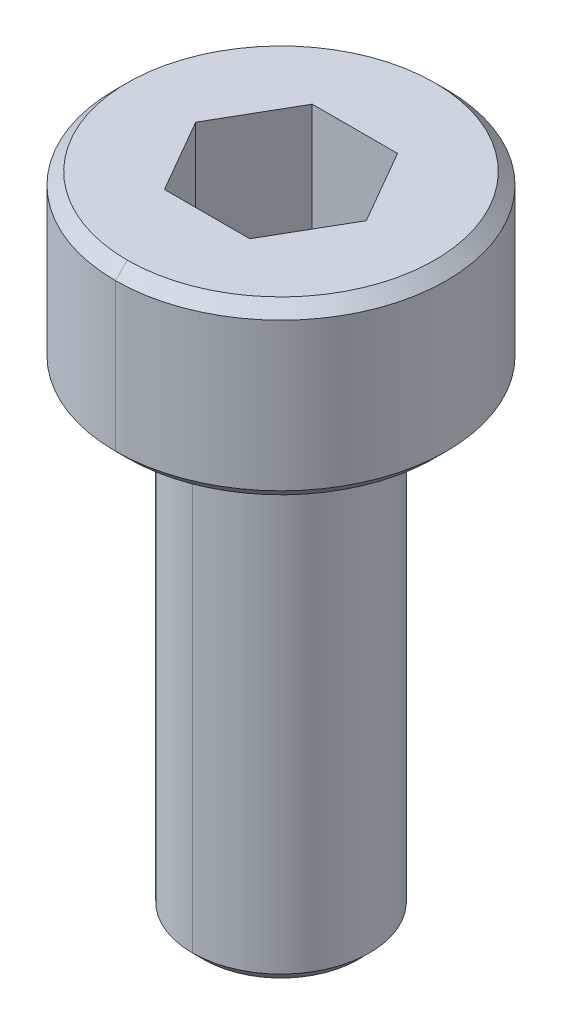
ISO-10303-21;
HEADER;
FILE_DESCRIPTION(('STEP AP214'),'2;1');
FILE_NAME('part.step','',(''),(''),'','','');
FILE_SCHEMA(('AUTOMOTIVE_DESIGN { 1 0 10303 214 1 1 1 1 }'));
ENDSEC;
DATA;
#1=APPLICATION_CONTEXT('core data for automotive mechanical design processes');
#2=APPLICATION_PROTOCOL_DEFINITION('international standard','automotive_design',2000,#1);
#3=PRODUCT_CONTEXT('',#1,'mechanical');
#4=PRODUCT('Part','Part','',(#3));
#5=PRODUCT_RELATED_PRODUCT_CATEGORY('part','',(#4));
#6=PRODUCT_DEFINITION_FORMATION('','',#4);
#7=PRODUCT_DEFINITION_CONTEXT('part definition',#1,'design');
#8=PRODUCT_DEFINITION('design','',#6,#7);
#9=PRODUCT_DEFINITION_SHAPE('','',#8);
#10=(LENGTH_UNIT() NAMED_UNIT(*) SI_UNIT(.MILLI.,.METRE.));
#11=(NAMED_UNIT(*) PLANE_ANGLE_UNIT() SI_UNIT($,.RADIAN.));
#12=(NAMED_UNIT(*) SI_UNIT($,.STERADIAN.) SOLID_ANGLE_UNIT());
#13=UNCERTAINTY_MEASURE_WITH_UNIT(LENGTH_MEASURE(1.E-05),#10,'distance_accuracy_value','');
#14=(GEOMETRIC_REPRESENTATION_CONTEXT(3) GLOBAL_UNCERTAINTY_ASSIGNED_CONTEXT((#13)) GLOBAL_UNIT_ASSIGNED_CONTEXT((#10,
#11,#12)) REPRESENTATION_CONTEXT('',''));
#15=CARTESIAN_POINT('',(0.,0.,0.));
#16=DIRECTION('',(0.,0.,1.));
#17=DIRECTION('',(1.,0.,0.));
#18=AXIS2_PLACEMENT_3D('',#15,#16,#17);
#19=CARTESIAN_POINT('',(0.721687836487033,8.9,1.25));
#20=DIRECTION('',(0.866025403784439,0.,0.5));
#21=DIRECTION('',(0.5,0.,-0.866025403784439));
#22=AXIS2_PLACEMENT_3D('',#19,#20,#21);
#23=PLANE('',#22);
#24=DIRECTION('',(0.5,0.,-0.866025403784439));
#25=VECTOR('',#24,1.);
#26=CARTESIAN_POINT('',(0.721687836487033,8.9,1.25));
#27=LINE('',#26,#25);
#28=CARTESIAN_POINT('',(0.721687836487033,8.9,1.25));
#29=VERTEX_POINT('',#28);
#30=CARTESIAN_POINT('',(1.44337567297407,8.9,0.));
#31=VERTEX_POINT('',#30);
#32=EDGE_CURVE('E178',#29,#31,#27,.T.);
#33=ORIENTED_EDGE('',*,*,#32,.F.);
#34=DIRECTION('',(0.,1.,0.));
#35=VECTOR('',#34,1.);
#36=CARTESIAN_POINT('',(0.721687836487033,8.9,1.25));
#37=LINE('',#36,#35);
#38=CARTESIAN_POINT('',(0.721687836487033,10.9,1.25));
#39=VERTEX_POINT('',#38);
#40=EDGE_CURVE('E166',#29,#39,#37,.T.);
#41=ORIENTED_EDGE('',*,*,#40,.T.);
#42=DIRECTION('',(0.5,0.,-0.866025403784439));
#43=VECTOR('',#42,1.);
#44=CARTESIAN_POINT('',(0.721687836487033,10.9,1.25));
#45=LINE('',#44,#43);
#46=CARTESIAN_POINT('',(1.44337567297406,10.9,0.));
#47=VERTEX_POINT('',#46);
#48=EDGE_CURVE('E180',#47,#39,#45,.F.);
#49=ORIENTED_EDGE('',*,*,#48,.F.);
#50=DIRECTION('',(0.,1.,0.));
#51=VECTOR('',#50,1.);
#52=CARTESIAN_POINT('',(1.44337567297406,8.9,0.));
#53=LINE('',#52,#51);
#54=EDGE_CURVE('E173',#47,#31,#53,.F.);
#55=ORIENTED_EDGE('',*,*,#54,.T.);
#56=EDGE_LOOP('',(#33,#41,#49,#55));
#57=FACE_BOUND('',#56,.T.);
#58=ADVANCED_FACE('F17',(#57),#23,.F.);
#59=CARTESIAN_POINT('',(1.44337567297406,8.9,0.));
#60=DIRECTION('',(0.866025403784438,0.,-0.5));
#61=DIRECTION('',(-0.5,0.,-0.866025403784438));
#62=AXIS2_PLACEMENT_3D('',#59,#60,#61);
#63=PLANE('',#62);
#64=DIRECTION('',(-0.5,0.,-0.866025403784438));
#65=VECTOR('',#64,1.);
#66=CARTESIAN_POINT('',(1.44337567297406,8.9,0.));
#67=LINE('',#66,#65);
#68=CARTESIAN_POINT('',(0.721687836487032,8.9,-1.25));
#69=VERTEX_POINT('',#68);
#70=EDGE_CURVE('E171',#31,#69,#67,.T.);
#71=ORIENTED_EDGE('',*,*,#70,.F.);
#72=ORIENTED_EDGE('',*,*,#54,.F.);
#73=DIRECTION('',(-0.5,0.,-0.866025403784438));
#74=VECTOR('',#73,1.);
#75=CARTESIAN_POINT('',(1.44337567297406,10.9,0.));
#76=LINE('',#75,#74);
#77=CARTESIAN_POINT('',(0.721687836487032,10.9,-1.25));
#78=VERTEX_POINT('',#77);
#79=EDGE_CURVE('E176',#78,#47,#76,.F.);
#80=ORIENTED_EDGE('',*,*,#79,.F.);
#81=DIRECTION('',(0.,1.,0.));
#82=VECTOR('',#81,1.);
#83=CARTESIAN_POINT('',(0.721687836487032,8.9,-1.25));
#84=LINE('',#83,#82);
#85=EDGE_CURVE('E161',#78,#69,#84,.F.);
#86=ORIENTED_EDGE('',*,*,#85,.T.);
#87=EDGE_LOOP('',(#71,#72,#80,#86));
#88=FACE_BOUND('',#87,.T.);
#89=ADVANCED_FACE('F417',(#88),#63,.F.);
#90=CARTESIAN_POINT('',(-0.721687836487032,8.9,1.25));
#91=DIRECTION('',(0.,0.,1.));
#92=DIRECTION('',(1.,0.,0.));
#93=AXIS2_PLACEMENT_3D('',#90,#91,#92);
#94=PLANE('',#93);
#95=DIRECTION('',(1.,0.,0.));
#96=VECTOR('',#95,1.);
#97=CARTESIAN_POINT('',(1.44337567297406,8.9,1.25));
#98=LINE('',#97,#96);
#99=CARTESIAN_POINT('',(-0.721687836487032,8.9,1.25));
#100=VERTEX_POINT('',#99);
#101=EDGE_CURVE('E158',#100,#29,#98,.T.);
#102=ORIENTED_EDGE('',*,*,#101,.F.);
#103=DIRECTION('',(0.,1.,0.));
#104=VECTOR('',#103,1.);
#105=CARTESIAN_POINT('',(-0.721687836487032,8.9,1.25));
#106=LINE('',#105,#104);
#107=CARTESIAN_POINT('',(-0.721687836487032,10.9,1.25));
#108=VERTEX_POINT('',#107);
#109=EDGE_CURVE('E147',#100,#108,#106,.T.);
#110=ORIENTED_EDGE('',*,*,#109,.T.);
#111=DIRECTION('',(1.,0.,0.));
#112=VECTOR('',#111,1.);
#113=CARTESIAN_POINT('',(-0.721687836487032,10.9,1.25));
#114=LINE('',#113,#112);
#115=EDGE_CURVE('E169',#39,#108,#114,.F.);
#116=ORIENTED_EDGE('',*,*,#115,.F.);
#117=ORIENTED_EDGE('',*,*,#40,.F.);
#118=EDGE_LOOP('',(#102,#110,#116,#117));
#119=FACE_BOUND('',#118,.T.);
#120=ADVANCED_FACE('F408',(#119),#94,.F.);
#121=CARTESIAN_POINT('',(0.721687836487032,8.9,-1.25));
#122=DIRECTION('',(0.,0.,-1.));
#123=DIRECTION('',(-1.,0.,0.));
#124=AXIS2_PLACEMENT_3D('',#121,#122,#123);
#125=PLANE('',#124);
#126=DIRECTION('',(1.,0.,0.));
#127=VECTOR('',#126,1.);
#128=CARTESIAN_POINT('',(1.44337567297406,8.9,-1.25));
#129=LINE('',#128,#127);
#130=CARTESIAN_POINT('',(-0.721687836487032,8.9,-1.25));
#131=VERTEX_POINT('',#130);
#132=EDGE_CURVE('E155',#69,#131,#129,.F.);
#133=ORIENTED_EDGE('',*,*,#132,.F.);
#134=ORIENTED_EDGE('',*,*,#85,.F.);
#135=DIRECTION('',(-1.,0.,0.));
#136=VECTOR('',#135,1.);
#137=CARTESIAN_POINT('',(0.721687836487032,10.9,-1.25));
#138=LINE('',#137,#136);
#139=CARTESIAN_POINT('',(-0.721687836487032,10.9,-1.25));
#140=VERTEX_POINT('',#139);
#141=EDGE_CURVE('E164',#140,#78,#138,.F.);
#142=ORIENTED_EDGE('',*,*,#141,.F.);
#143=DIRECTION('',(0.,1.,0.));
#144=VECTOR('',#143,1.);
#145=CARTESIAN_POINT('',(-0.721687836487032,8.9,-1.25));
#146=LINE('',#145,#144);
#147=EDGE_CURVE('E145',#140,#131,#146,.F.);
#148=ORIENTED_EDGE('',*,*,#147,.T.);
#149=EDGE_LOOP('',(#133,#134,#142,#148));
#150=FACE_BOUND('',#149,.T.);
#151=ADVANCED_FACE('F399',(#150),#125,.F.);
#152=CARTESIAN_POINT('',(1.44337567297406,8.9,0.));
#153=DIRECTION('',(0.,1.,0.));
#154=DIRECTION('',(0.,0.,1.));
#155=AXIS2_PLACEMENT_3D('',#152,#153,#154);
#156=PLANE('',#155);
#157=ORIENTED_EDGE('',*,*,#132,.T.);
#158=DIRECTION('',(-0.5,0.,0.866025403784439));
#159=VECTOR('',#158,1.);
#160=CARTESIAN_POINT('',(-0.721687836487032,8.9,-1.25));
#161=LINE('',#160,#159);
#162=CARTESIAN_POINT('',(-1.44337567297406,8.9,0.));
#163=VERTEX_POINT('',#162);
#164=EDGE_CURVE('E143',#131,#163,#161,.T.);
#165=ORIENTED_EDGE('',*,*,#164,.T.);
#166=DIRECTION('',(0.5,0.,0.866025403784438));
#167=VECTOR('',#166,1.);
#168=CARTESIAN_POINT('',(-1.44337567297406,8.9,0.));
#169=LINE('',#168,#167);
#170=EDGE_CURVE('E150',#163,#100,#169,.T.);
#171=ORIENTED_EDGE('',*,*,#170,.T.);
#172=ORIENTED_EDGE('',*,*,#101,.T.);
#173=ORIENTED_EDGE('',*,*,#32,.T.);
#174=ORIENTED_EDGE('',*,*,#70,.T.);
#175=EDGE_LOOP('',(#157,#165,#171,#172,#173,#174));
#176=FACE_BOUND('',#175,.T.);
#177=ADVANCED_FACE('F390',(#176),#156,.T.);
#178=CARTESIAN_POINT('',(-1.44337567297406,8.9,0.));
#179=DIRECTION('',(-0.866025403784438,0.,0.5));
#180=DIRECTION('',(0.5,0.,0.866025403784438));
#181=AXIS2_PLACEMENT_3D('',#178,#179,#180);
#182=PLANE('',#181);
#183=ORIENTED_EDGE('',*,*,#170,.F.);
#184=DIRECTION('',(0.,1.,0.));
#185=VECTOR('',#184,1.);
#186=CARTESIAN_POINT('',(-1.44337567297406,8.9,0.));
#187=LINE('',#186,#185);
#188=CARTESIAN_POINT('',(-1.44337567297406,10.9,0.));
#189=VERTEX_POINT('',#188);
#190=EDGE_CURVE('E140',#163,#189,#187,.T.);
#191=ORIENTED_EDGE('',*,*,#190,.T.);
#192=DIRECTION('',(0.5,0.,0.866025403784438));
#193=VECTOR('',#192,1.);
#194=CARTESIAN_POINT('',(-1.44337567297406,10.9,0.));
#195=LINE('',#194,#193);
#196=EDGE_CURVE('E153',#108,#189,#195,.F.);
#197=ORIENTED_EDGE('',*,*,#196,.F.);
#198=ORIENTED_EDGE('',*,*,#109,.F.);
#199=EDGE_LOOP('',(#183,#191,#197,#198));
#200=FACE_BOUND('',#199,.T.);
#201=ADVANCED_FACE('F381',(#200),#182,.F.);
#202=CARTESIAN_POINT('',(-0.721687836487032,8.9,-1.25));
#203=DIRECTION('',(-0.866025403784439,0.,-0.5));
#204=DIRECTION('',(-0.5,0.,0.866025403784439));
#205=AXIS2_PLACEMENT_3D('',#202,#203,#204);
#206=PLANE('',#205);
#207=ORIENTED_EDGE('',*,*,#164,.F.);
#208=ORIENTED_EDGE('',*,*,#147,.F.);
#209=DIRECTION('',(0.5,0.,-0.866025403784439));
#210=VECTOR('',#209,1.);
#211=CARTESIAN_POINT('',(-1.44337567297406,10.9,0.));
#212=LINE('',#211,#210);
#213=EDGE_CURVE('E121',#189,#140,#212,.T.);
#214=ORIENTED_EDGE('',*,*,#213,.F.);
#215=ORIENTED_EDGE('',*,*,#190,.F.);
#216=EDGE_LOOP('',(#207,#208,#214,#215));
#217=FACE_BOUND('',#216,.T.);
#218=ADVANCED_FACE('F372',(#217),#206,.F.);
#219=CARTESIAN_POINT('',(0.,10.9,-2.8));
#220=DIRECTION('',(0.,1.,0.));
#221=DIRECTION('',(0.,0.,1.));
#222=AXIS2_PLACEMENT_3D('',#219,#220,#221);
#223=PLANE('',#222);
#224=ORIENTED_EDGE('',*,*,#196,.T.);
#225=ORIENTED_EDGE('',*,*,#213,.T.);
#226=ORIENTED_EDGE('',*,*,#141,.T.);
#227=ORIENTED_EDGE('',*,*,#79,.T.);
#228=ORIENTED_EDGE('',*,*,#48,.T.);
#229=ORIENTED_EDGE('',*,*,#115,.T.);
#230=EDGE_LOOP('',(#224,#225,#226,#227,#228,#229));
#231=FACE_BOUND('',#230,.T.);
#232=CARTESIAN_POINT('',(0.,10.9000000000492,0.));
#233=DIRECTION('',(0.,-1.,0.));
#234=DIRECTION('',(0.,0.,-1.));
#235=AXIS2_PLACEMENT_3D('',#232,#233,#234);
#236=CIRCLE('',#235,2.59999999991578);
#237=CARTESIAN_POINT('',(0.,10.9000000000492,-2.59999999991578));
#238=VERTEX_POINT('',#237);
#239=CARTESIAN_POINT('',(0.,10.9000000000492,2.59999999991578));
#240=VERTEX_POINT('',#239);
#241=EDGE_CURVE('E111',#238,#240,#236,.T.);
#242=ORIENTED_EDGE('',*,*,#241,.F.);
#243=CARTESIAN_POINT('',(0.,10.9000000000492,0.));
#244=DIRECTION('',(0.,-1.,0.));
#245=DIRECTION('',(0.,0.,-1.));
#246=AXIS2_PLACEMENT_3D('',#243,#244,#245);
#247=CIRCLE('',#246,2.59999999991578);
#248=EDGE_CURVE('E20',#240,#238,#247,.T.);
#249=ORIENTED_EDGE('',*,*,#248,.F.);
#250=EDGE_LOOP('',(#242,#249));
#251=FACE_BOUND('',#250,.T.);
#252=ADVANCED_FACE('F112',(#231,#251),#223,.T.);
#253=CARTESIAN_POINT('',(0.,10.7000000001563,0.));
#254=DIRECTION('',(0.,-1.,0.));
#255=DIRECTION('',(0.,0.,-1.));
#256=AXIS2_PLACEMENT_3D('',#253,#254,#255);
#257=CONICAL_SURFACE('',#256,2.79999999980873,0.785398163397448);
#258=DIRECTION('',(0.,0.707106781186548,0.707106781186548));
#259=VECTOR('',#258,1.);
#260=CARTESIAN_POINT('',(0.,-498986.5,-499000.));
#261=LINE('',#260,#259);
#262=CARTESIAN_POINT('',(0.,10.7000000000249,-2.79999999996639));
#263=VERTEX_POINT('',#262);
#264=EDGE_CURVE('E119',#263,#238,#261,.T.);
#265=ORIENTED_EDGE('',*,*,#264,.F.);
#266=CARTESIAN_POINT('',(0.,10.7,0.));
#267=DIRECTION('',(0.,-1.,0.));
#268=DIRECTION('',(0.,0.,-1.));
#269=AXIS2_PLACEMENT_3D('',#266,#267,#268);
#270=CIRCLE('',#269,2.8);
#271=CARTESIAN_POINT('',(0.,10.7000000000249,2.79999999996639));
#272=VERTEX_POINT('',#271);
#273=EDGE_CURVE('E126',#272,#263,#270,.T.);
#274=ORIENTED_EDGE('',*,*,#273,.F.);
#275=DIRECTION('',(0.,0.707106781186548,-0.707106781186548));
#276=VECTOR('',#275,1.);
#277=CARTESIAN_POINT('',(6.11098752774529E-11,-498986.5,499000.));
#278=LINE('',#277,#276);
#279=EDGE_CURVE('E116',#240,#272,#278,.F.);
#280=ORIENTED_EDGE('',*,*,#279,.F.);
#281=ORIENTED_EDGE('',*,*,#248,.T.);
#282=EDGE_LOOP('',(#265,#274,#280,#281));
#283=FACE_BOUND('',#282,.T.);
#284=ADVANCED_FACE('F118',(#283),#257,.T.);
#285=CARTESIAN_POINT('',(0.,10.7000000001563,0.));
#286=DIRECTION('',(0.,-1.,0.));
#287=DIRECTION('',(0.,0.,-1.));
#288=AXIS2_PLACEMENT_3D('',#285,#286,#287);
#289=CONICAL_SURFACE('',#288,2.79999999980873,0.785398163397448);
#290=CARTESIAN_POINT('',(0.,10.7,0.));
#291=DIRECTION('',(0.,-1.,0.));
#292=DIRECTION('',(0.,0.,-1.));
#293=AXIS2_PLACEMENT_3D('',#290,#291,#292);
#294=CIRCLE('',#293,2.8);
#295=EDGE_CURVE('E124',#263,#272,#294,.T.);
#296=ORIENTED_EDGE('',*,*,#295,.F.);
#297=ORIENTED_EDGE('',*,*,#264,.T.);
#298=ORIENTED_EDGE('',*,*,#241,.T.);
#299=ORIENTED_EDGE('',*,*,#279,.T.);
#300=EDGE_LOOP('',(#296,#297,#298,#299));
#301=FACE_BOUND('',#300,.T.);
#302=ADVANCED_FACE('F122',(#301),#289,.T.);
#303=CARTESIAN_POINT('',(0.,0.,0.));
#304=DIRECTION('',(0.,-1.,0.));
#305=DIRECTION('',(0.,0.,-1.));
#306=AXIS2_PLACEMENT_3D('',#303,#304,#305);
#307=CYLINDRICAL_SURFACE('',#306,2.8);
#308=DIRECTION('',(0.,-1.,0.));
#309=VECTOR('',#308,1.);
#310=CARTESIAN_POINT('',(0.,0.,-2.8));
#311=LINE('',#310,#309);
#312=CARTESIAN_POINT('',(0.,8.19999999996668,-2.79999999999866));
#313=VERTEX_POINT('',#312);
#314=EDGE_CURVE('E225',#313,#263,#311,.F.);
#315=ORIENTED_EDGE('',*,*,#314,.F.);
#316=CARTESIAN_POINT('',(0.,8.19999999998799,0.));
#317=DIRECTION('',(0.,1.,0.));
#318=DIRECTION('',(0.,0.,1.));
#319=AXIS2_PLACEMENT_3D('',#316,#317,#318);
#320=CIRCLE('',#319,2.80000000003611);
#321=CARTESIAN_POINT('',(0.,8.19999999998799,2.79999999999866));
#322=VERTEX_POINT('',#321);
#323=EDGE_CURVE('E220',#322,#313,#320,.F.);
#324=ORIENTED_EDGE('',*,*,#323,.F.);
#325=DIRECTION('',(0.,-1.,0.));
#326=VECTOR('',#325,1.);
#327=CARTESIAN_POINT('',(0.,0.,2.8));
#328=LINE('',#327,#326);
#329=EDGE_CURVE('E230',#272,#322,#328,.T.);
#330=ORIENTED_EDGE('',*,*,#329,.F.);
#331=ORIENTED_EDGE('',*,*,#273,.T.);
#332=EDGE_LOOP('',(#315,#324,#330,#331));
#333=FACE_BOUND('',#332,.T.);
#334=ADVANCED_FACE('F245',(#333),#307,.T.);
#335=CARTESIAN_POINT('',(0.,0.,0.));
#336=DIRECTION('',(0.,-1.,0.));
#337=DIRECTION('',(0.,0.,-1.));
#338=AXIS2_PLACEMENT_3D('',#335,#336,#337);
#339=CYLINDRICAL_SURFACE('',#338,2.8);
#340=CARTESIAN_POINT('',(0.,8.19999999998799,0.));
#341=DIRECTION('',(0.,1.,0.));
#342=DIRECTION('',(0.,0.,1.));
#343=AXIS2_PLACEMENT_3D('',#340,#341,#342);
#344=CIRCLE('',#343,2.80000000003611);
#345=EDGE_CURVE('E205',#313,#322,#344,.F.);
#346=ORIENTED_EDGE('',*,*,#345,.F.);
#347=ORIENTED_EDGE('',*,*,#314,.T.);
#348=ORIENTED_EDGE('',*,*,#295,.T.);
#349=ORIENTED_EDGE('',*,*,#329,.T.);
#350=EDGE_LOOP('',(#346,#347,#348,#349));
#351=FACE_BOUND('',#350,.T.);
#352=ADVANCED_FACE('F242',(#351),#339,.T.);
#353=CARTESIAN_POINT('',(0.,8.19999999993115,0.));
#354=DIRECTION('',(0.,1.,0.));
#355=DIRECTION('',(0.,0.,1.));
#356=AXIS2_PLACEMENT_3D('',#353,#354,#355);
#357=CONICAL_SURFACE('',#356,2.79999999992242,0.78539816325534);
#358=DIRECTION('',(0.,-0.707106781287034,-0.707106781086062));
#359=VECTOR('',#358,1.);
#360=CARTESIAN_POINT('',(0.,499000.,498994.599858178));
#361=LINE('',#360,#359);
#362=CARTESIAN_POINT('',(0.,7.99999999992451,2.60000000000105));
#363=VERTEX_POINT('',#362);
#364=EDGE_CURVE('E202',#322,#363,#361,.T.);
#365=ORIENTED_EDGE('',*,*,#364,.F.);
#366=ORIENTED_EDGE('',*,*,#323,.T.);
#367=DIRECTION('',(0.,-0.707106781287034,0.707106781086062));
#368=VECTOR('',#367,1.);
#369=CARTESIAN_POINT('',(6.11092139508132E-11,499000.,-498994.599858178));
#370=LINE('',#369,#368);
#371=CARTESIAN_POINT('',(0.,7.99999999992451,-2.60000000000105));
#372=VERTEX_POINT('',#371);
#373=EDGE_CURVE('E211',#372,#313,#370,.F.);
#374=ORIENTED_EDGE('',*,*,#373,.F.);
#375=CARTESIAN_POINT('',(0.,7.99999999992451,0.));
#376=DIRECTION('',(0.,1.,0.));
#377=DIRECTION('',(0.,0.,1.));
#378=AXIS2_PLACEMENT_3D('',#375,#376,#377);
#379=CIRCLE('',#378,2.59999999997262);
#380=EDGE_CURVE('E197',#363,#372,#379,.F.);
#381=ORIENTED_EDGE('',*,*,#380,.F.);
#382=EDGE_LOOP('',(#365,#366,#374,#381));
#383=FACE_BOUND('',#382,.T.);
#384=ADVANCED_FACE('F247',(#383),#357,.T.);
#385=CARTESIAN_POINT('',(0.,8.19999999993115,0.));
#386=DIRECTION('',(0.,1.,0.));
#387=DIRECTION('',(0.,0.,1.));
#388=AXIS2_PLACEMENT_3D('',#385,#386,#387);
#389=CONICAL_SURFACE('',#388,2.79999999992242,0.78539816325534);
#390=ORIENTED_EDGE('',*,*,#345,.T.);
#391=ORIENTED_EDGE('',*,*,#364,.T.);
#392=CARTESIAN_POINT('',(0.,7.99999999992451,0.));
#393=DIRECTION('',(0.,1.,0.));
#394=DIRECTION('',(0.,0.,1.));
#395=AXIS2_PLACEMENT_3D('',#392,#393,#394);
#396=CIRCLE('',#395,2.59999999997262);
#397=EDGE_CURVE('E194',#372,#363,#396,.F.);
#398=ORIENTED_EDGE('',*,*,#397,.F.);
#399=ORIENTED_EDGE('',*,*,#373,.T.);
#400=EDGE_LOOP('',(#390,#391,#398,#399));
#401=FACE_BOUND('',#400,.T.);
#402=ADVANCED_FACE('F248',(#401),#389,.T.);
#403=CARTESIAN_POINT('',(0.,0.,0.));
#404=DIRECTION('',(0.,-1.,0.));
#405=DIRECTION('',(0.,0.,-1.));
#406=AXIS2_PLACEMENT_3D('',#403,#404,#405);
#407=PLANE('',#406);
#408=CARTESIAN_POINT('',(0.,0.,0.));
#409=DIRECTION('',(0.,1.,0.));
#410=DIRECTION('',(0.,0.,1.));
#411=AXIS2_PLACEMENT_3D('',#408,#409,#410);
#412=CIRCLE('',#411,1.30000000001473);
#413=CARTESIAN_POINT('',(0.,0.,1.30000000001473));
#414=VERTEX_POINT('',#413);
#415=CARTESIAN_POINT('',(0.,0.,-1.30000000001473));
#416=VERTEX_POINT('',#415);
#417=EDGE_CURVE('E190',#414,#416,#412,.T.);
#418=ORIENTED_EDGE('',*,*,#417,.F.);
#419=CARTESIAN_POINT('',(0.,0.,0.));
#420=DIRECTION('',(0.,1.,0.));
#421=DIRECTION('',(0.,0.,1.));
#422=AXIS2_PLACEMENT_3D('',#419,#420,#421);
#423=CIRCLE('',#422,1.30000000001473);
#424=EDGE_CURVE('E200',#416,#414,#423,.T.);
#425=ORIENTED_EDGE('',*,*,#424,.F.);
#426=EDGE_LOOP('',(#418,#425));
#427=FACE_BOUND('',#426,.T.);
#428=ADVANCED_FACE('F270',(#427),#407,.T.);
#429=CARTESIAN_POINT('',(0.,0.200000000006639,0.));
#430=DIRECTION('',(0.,1.,0.));
#431=DIRECTION('',(0.,0.,1.));
#432=AXIS2_PLACEMENT_3D('',#429,#430,#431);
#433=CONICAL_SURFACE('',#432,1.50000000007822,0.785398163539557);
#434=DIRECTION('',(0.,-0.707106781086062,-0.707106781287033));
#435=VECTOR('',#434,1.);
#436=CARTESIAN_POINT('',(0.,498998.699858176,499000.));
#437=LINE('',#436,#435);
#438=CARTESIAN_POINT('',(0.,0.20000000000415,1.50000000004889));
#439=VERTEX_POINT('',#438);
#440=EDGE_CURVE('E189',#439,#414,#437,.T.);
#441=ORIENTED_EDGE('',*,*,#440,.F.);
#442=CARTESIAN_POINT('',(0.,0.200000000000001,0.));
#443=DIRECTION('',(0.,-1.,0.));
#444=DIRECTION('',(0.,0.,-1.));
#445=AXIS2_PLACEMENT_3D('',#442,#443,#444);
#446=CIRCLE('',#445,1.5);
#447=CARTESIAN_POINT('',(0.,0.20000000000498,-1.50000000005866));
#448=VERTEX_POINT('',#447);
#449=EDGE_CURVE('E35',#448,#439,#446,.F.);
#450=ORIENTED_EDGE('',*,*,#449,.F.);
#451=DIRECTION('',(0.,-0.707106781086062,0.707106781287033));
#452=VECTOR('',#451,1.);
#453=CARTESIAN_POINT('',(6.11098752774529E-11,498998.699858176,-499000.));
#454=LINE('',#453,#452);
#455=EDGE_CURVE('E193',#416,#448,#454,.F.);
#456=ORIENTED_EDGE('',*,*,#455,.F.);
#457=ORIENTED_EDGE('',*,*,#424,.T.);
#458=EDGE_LOOP('',(#441,#450,#456,#457));
#459=FACE_BOUND('',#458,.T.);
#460=ADVANCED_FACE('F254',(#459),#433,.T.);
#461=CARTESIAN_POINT('',(0.,8.,-1.5));
#462=DIRECTION('',(0.,-1.,0.));
#463=DIRECTION('',(0.,0.,-1.));
#464=AXIS2_PLACEMENT_3D('',#461,#462,#463);
#465=PLANE('',#464);
#466=ORIENTED_EDGE('',*,*,#380,.T.);
#467=ORIENTED_EDGE('',*,*,#397,.T.);
#468=EDGE_LOOP('',(#466,#467));
#469=FACE_BOUND('',#468,.T.);
#470=CARTESIAN_POINT('',(0.,8.,0.));
#471=DIRECTION('',(0.,-1.,0.));
#472=DIRECTION('',(0.,0.,-1.));
#473=AXIS2_PLACEMENT_3D('',#470,#471,#472);
#474=CIRCLE('',#473,1.5);
#475=CARTESIAN_POINT('',(0.,8.,-1.5));
#476=VERTEX_POINT('',#475);
#477=CARTESIAN_POINT('',(0.,8.,1.5));
#478=VERTEX_POINT('',#477);
#479=EDGE_CURVE('E182',#476,#478,#474,.T.);
#480=ORIENTED_EDGE('',*,*,#479,.F.);
#481=CARTESIAN_POINT('',(0.,8.,0.));
#482=DIRECTION('',(0.,-1.,0.));
#483=DIRECTION('',(0.,0.,-1.));
#484=AXIS2_PLACEMENT_3D('',#481,#482,#483);
#485=CIRCLE('',#484,1.5);
#486=EDGE_CURVE('E186',#478,#476,#485,.T.);
#487=ORIENTED_EDGE('',*,*,#486,.F.);
#488=EDGE_LOOP('',(#480,#487));
#489=FACE_BOUND('',#488,.T.);
#490=ADVANCED_FACE('F250',(#469,#489),#465,.T.);
#491=CARTESIAN_POINT('',(0.,0.200000000006639,0.));
#492=DIRECTION('',(0.,1.,0.));
#493=DIRECTION('',(0.,0.,1.));
#494=AXIS2_PLACEMENT_3D('',#491,#492,#493);
#495=CONICAL_SURFACE('',#494,1.50000000007822,0.785398163539557);
#496=CARTESIAN_POINT('',(0.,0.200000000000001,0.));
#497=DIRECTION('',(0.,-1.,0.));
#498=DIRECTION('',(0.,0.,-1.));
#499=AXIS2_PLACEMENT_3D('',#496,#497,#498);
#500=CIRCLE('',#499,1.5);
#501=EDGE_CURVE('E26',#439,#448,#500,.F.);
#502=ORIENTED_EDGE('',*,*,#501,.F.);
#503=ORIENTED_EDGE('',*,*,#440,.T.);
#504=ORIENTED_EDGE('',*,*,#417,.T.);
#505=ORIENTED_EDGE('',*,*,#455,.T.);
#506=EDGE_LOOP('',(#502,#503,#504,#505));
#507=FACE_BOUND('',#506,.T.);
#508=ADVANCED_FACE('F253',(#507),#495,.T.);
#509=CARTESIAN_POINT('',(0.,0.,0.));
#510=DIRECTION('',(0.,-1.,0.));
#511=DIRECTION('',(0.,0.,-1.));
#512=AXIS2_PLACEMENT_3D('',#509,#510,#511);
#513=CYLINDRICAL_SURFACE('',#512,1.5);
#514=DIRECTION('',(0.,-1.,0.));
#515=VECTOR('',#514,1.);
#516=CARTESIAN_POINT('',(0.,0.,-1.5));
#517=LINE('',#516,#515);
#518=EDGE_CURVE('E11',#448,#476,#517,.F.);
#519=ORIENTED_EDGE('',*,*,#518,.F.);
#520=ORIENTED_EDGE('',*,*,#449,.T.);
#521=DIRECTION('',(0.,-1.,0.));
#522=VECTOR('',#521,1.);
#523=CARTESIAN_POINT('',(0.,0.,1.5));
#524=LINE('',#523,#522);
#525=EDGE_CURVE('E185',#478,#439,#524,.T.);
#526=ORIENTED_EDGE('',*,*,#525,.F.);
#527=ORIENTED_EDGE('',*,*,#486,.T.);
#528=EDGE_LOOP('',(#519,#520,#526,#527));
#529=FACE_BOUND('',#528,.T.);
#530=ADVANCED_FACE('F261',(#529),#513,.T.);
#531=CARTESIAN_POINT('',(0.,0.,0.));
#532=DIRECTION('',(0.,-1.,0.));
#533=DIRECTION('',(0.,0.,-1.));
#534=AXIS2_PLACEMENT_3D('',#531,#532,#533);
#535=CYLINDRICAL_SURFACE('',#534,1.5);
#536=ORIENTED_EDGE('',*,*,#501,.T.);
#537=ORIENTED_EDGE('',*,*,#518,.T.);
#538=ORIENTED_EDGE('',*,*,#479,.T.);
#539=ORIENTED_EDGE('',*,*,#525,.T.);
#540=EDGE_LOOP('',(#536,#537,#538,#539));
#541=FACE_BOUND('',#540,.T.);
#542=ADVANCED_FACE('F263',(#541),#535,.T.);
#543=CLOSED_SHELL('',(#58,#89,#120,#151,#177,#201,#218,#252,#284,#302,#334,#352,#384,#402,#428,
#460,#490,#508,#530,#542));
#544=MANIFOLD_SOLID_BREP('B1',#543);
#545=ADVANCED_BREP_SHAPE_REPRESENTATION('',(#18,#544),#14);
#546=SHAPE_DEFINITION_REPRESENTATION(#9,#545);
ENDSEC;
END-ISO-10303-21;
